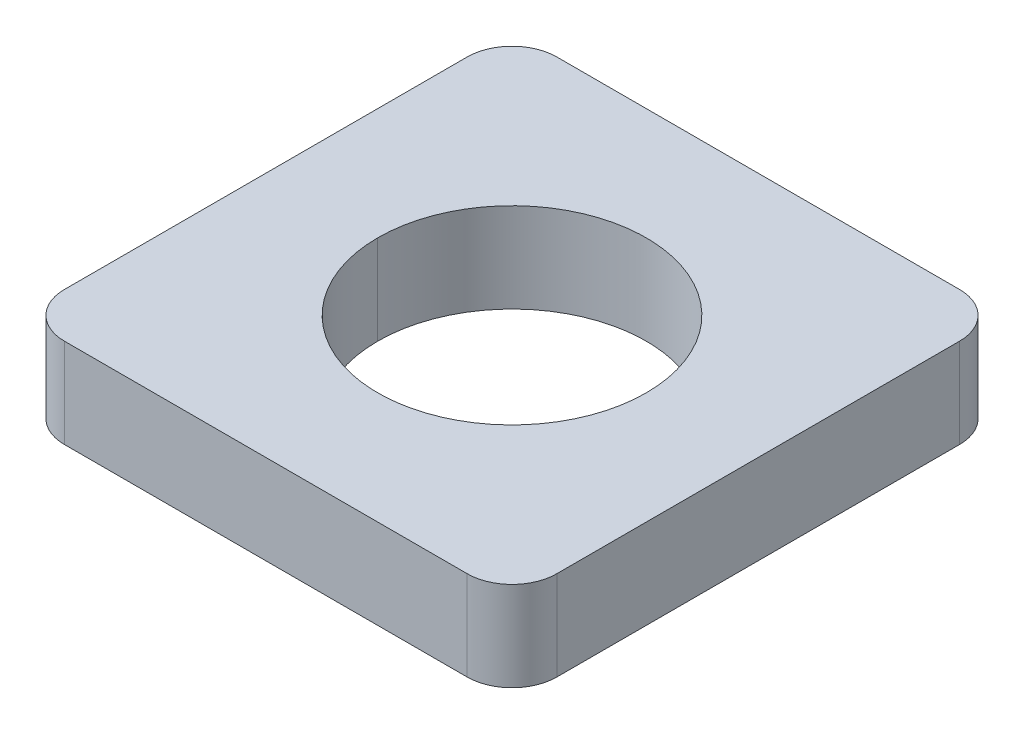
ISO-10303-21;
HEADER;
FILE_DESCRIPTION(('STEP AP214'),'2;1');
FILE_NAME('part.step','',(''),(''),'','','');
FILE_SCHEMA(('AUTOMOTIVE_DESIGN { 1 0 10303 214 1 1 1 1 }'));
ENDSEC;
DATA;
#1=APPLICATION_CONTEXT('core data for automotive mechanical design processes');
#2=APPLICATION_PROTOCOL_DEFINITION('international standard','automotive_design',2000,#1);
#3=PRODUCT_CONTEXT('',#1,'mechanical');
#4=PRODUCT('Part','Part','',(#3));
#5=PRODUCT_RELATED_PRODUCT_CATEGORY('part','',(#4));
#6=PRODUCT_DEFINITION_FORMATION('','',#4);
#7=PRODUCT_DEFINITION_CONTEXT('part definition',#1,'design');
#8=PRODUCT_DEFINITION('design','',#6,#7);
#9=PRODUCT_DEFINITION_SHAPE('','',#8);
#10=(LENGTH_UNIT() NAMED_UNIT(*) SI_UNIT(.MILLI.,.METRE.));
#11=(NAMED_UNIT(*) PLANE_ANGLE_UNIT() SI_UNIT($,.RADIAN.));
#12=(NAMED_UNIT(*) SI_UNIT($,.STERADIAN.) SOLID_ANGLE_UNIT());
#13=UNCERTAINTY_MEASURE_WITH_UNIT(LENGTH_MEASURE(1.E-05),#10,'distance_accuracy_value','');
#14=(GEOMETRIC_REPRESENTATION_CONTEXT(3) GLOBAL_UNCERTAINTY_ASSIGNED_CONTEXT((#13)) GLOBAL_UNIT_ASSIGNED_CONTEXT((#10,
#11,#12)) REPRESENTATION_CONTEXT('',''));
#15=CARTESIAN_POINT('',(0.,0.,0.));
#16=DIRECTION('',(0.,0.,1.));
#17=DIRECTION('',(1.,0.,0.));
#18=AXIS2_PLACEMENT_3D('',#15,#16,#17);
#19=CARTESIAN_POINT('',(2.75,0.,-2.75));
#20=DIRECTION('',(0.,0.,-1.));
#21=DIRECTION('',(0.,-1.,0.));
#22=AXIS2_PLACEMENT_3D('',#19,#20,#21);
#23=PLANE('',#22);
#24=DIRECTION('',(-1.,0.,0.));
#25=VECTOR('',#24,1.);
#26=CARTESIAN_POINT('',(2.25,0.,-2.75));
#27=LINE('',#26,#25);
#28=CARTESIAN_POINT('',(2.25,0.,-2.75));
#29=VERTEX_POINT('',#28);
#30=CARTESIAN_POINT('',(-2.25,0.,-2.75));
#31=VERTEX_POINT('',#30);
#32=EDGE_CURVE('E199',#29,#31,#27,.T.);
#33=ORIENTED_EDGE('',*,*,#32,.T.);
#34=DIRECTION('',(0.,-1.,0.));
#35=VECTOR('',#34,1.);
#36=CARTESIAN_POINT('',(-2.25,1.,-2.75));
#37=LINE('',#36,#35);
#38=CARTESIAN_POINT('',(-2.25,1.,-2.75));
#39=VERTEX_POINT('',#38);
#40=EDGE_CURVE('E11',#39,#31,#37,.T.);
#41=ORIENTED_EDGE('',*,*,#40,.F.);
#42=DIRECTION('',(-1.,0.,0.));
#43=VECTOR('',#42,1.);
#44=CARTESIAN_POINT('',(2.25,1.,-2.75));
#45=LINE('',#44,#43);
#46=CARTESIAN_POINT('',(2.25,1.,-2.75));
#47=VERTEX_POINT('',#46);
#48=EDGE_CURVE('E149',#47,#39,#45,.T.);
#49=ORIENTED_EDGE('',*,*,#48,.F.);
#50=DIRECTION('',(0.,-1.,0.));
#51=VECTOR('',#50,1.);
#52=CARTESIAN_POINT('',(2.25,1.,-2.75));
#53=LINE('',#52,#51);
#54=EDGE_CURVE('E74',#47,#29,#53,.T.);
#55=ORIENTED_EDGE('',*,*,#54,.T.);
#56=EDGE_LOOP('',(#33,#41,#49,#55));
#57=FACE_BOUND('',#56,.T.);
#58=ADVANCED_FACE('F17',(#57),#23,.T.);
#59=CARTESIAN_POINT('',(-2.25,2.3036,-2.25));
#60=DIRECTION('',(0.,-1.,0.));
#61=DIRECTION('',(-1.,0.,0.));
#62=AXIS2_PLACEMENT_3D('',#59,#60,#61);
#63=CYLINDRICAL_SURFACE('',#62,0.5);
#64=DIRECTION('',(0.,-1.,0.));
#65=VECTOR('',#64,1.);
#66=CARTESIAN_POINT('',(-2.75,1.,-2.25));
#67=LINE('',#66,#65);
#68=CARTESIAN_POINT('',(-2.75,1.,-2.25));
#69=VERTEX_POINT('',#68);
#70=CARTESIAN_POINT('',(-2.75,0.,-2.25));
#71=VERTEX_POINT('',#70);
#72=EDGE_CURVE('E28',#69,#71,#67,.T.);
#73=ORIENTED_EDGE('',*,*,#72,.F.);
#74=CARTESIAN_POINT('',(-2.25,1.,-2.25));
#75=DIRECTION('',(0.,1.,0.));
#76=DIRECTION('',(0.,0.,-1.));
#77=AXIS2_PLACEMENT_3D('',#74,#75,#76);
#78=CIRCLE('',#77,0.5);
#79=EDGE_CURVE('E231',#39,#69,#78,.T.);
#80=ORIENTED_EDGE('',*,*,#79,.F.);
#81=ORIENTED_EDGE('',*,*,#40,.T.);
#82=CARTESIAN_POINT('',(-2.25,0.,-2.25));
#83=DIRECTION('',(0.,-1.,0.));
#84=DIRECTION('',(-1.,0.,0.));
#85=AXIS2_PLACEMENT_3D('',#82,#83,#84);
#86=CIRCLE('',#85,0.5);
#87=EDGE_CURVE('E176',#71,#31,#86,.T.);
#88=ORIENTED_EDGE('',*,*,#87,.F.);
#89=EDGE_LOOP('',(#73,#80,#81,#88));
#90=FACE_BOUND('',#89,.T.);
#91=ADVANCED_FACE('F481',(#90),#63,.T.);
#92=CARTESIAN_POINT('',(-2.75,0.,-2.75));
#93=DIRECTION('',(-1.,0.,0.));
#94=DIRECTION('',(0.,0.,1.));
#95=AXIS2_PLACEMENT_3D('',#92,#93,#94);
#96=PLANE('',#95);
#97=DIRECTION('',(0.,0.,1.));
#98=VECTOR('',#97,1.);
#99=CARTESIAN_POINT('',(-2.75,1.,-2.25));
#100=LINE('',#99,#98);
#101=CARTESIAN_POINT('',(-2.75,1.,2.25));
#102=VERTEX_POINT('',#101);
#103=EDGE_CURVE('E210',#69,#102,#100,.T.);
#104=ORIENTED_EDGE('',*,*,#103,.F.);
#105=ORIENTED_EDGE('',*,*,#72,.T.);
#106=DIRECTION('',(0.,0.,1.));
#107=VECTOR('',#106,1.);
#108=CARTESIAN_POINT('',(-2.75,0.,-2.25));
#109=LINE('',#108,#107);
#110=CARTESIAN_POINT('',(-2.75,0.,2.25));
#111=VERTEX_POINT('',#110);
#112=EDGE_CURVE('E174',#71,#111,#109,.T.);
#113=ORIENTED_EDGE('',*,*,#112,.T.);
#114=DIRECTION('',(0.,-1.,0.));
#115=VECTOR('',#114,1.);
#116=CARTESIAN_POINT('',(-2.75,1.,2.25));
#117=LINE('',#116,#115);
#118=EDGE_CURVE('E127',#102,#111,#117,.T.);
#119=ORIENTED_EDGE('',*,*,#118,.F.);
#120=EDGE_LOOP('',(#104,#105,#113,#119));
#121=FACE_BOUND('',#120,.T.);
#122=ADVANCED_FACE('F19',(#121),#96,.T.);
#123=CARTESIAN_POINT('',(-2.25,2.3036,2.25));
#124=DIRECTION('',(0.,-1.,0.));
#125=DIRECTION('',(0.,0.,1.));
#126=AXIS2_PLACEMENT_3D('',#123,#124,#125);
#127=CYLINDRICAL_SURFACE('',#126,0.5);
#128=DIRECTION('',(0.,-1.,0.));
#129=VECTOR('',#128,1.);
#130=CARTESIAN_POINT('',(-2.25,1.,2.75));
#131=LINE('',#130,#129);
#132=CARTESIAN_POINT('',(-2.25,1.,2.75));
#133=VERTEX_POINT('',#132);
#134=CARTESIAN_POINT('',(-2.25,0.,2.75));
#135=VERTEX_POINT('',#134);
#136=EDGE_CURVE('E116',#133,#135,#131,.T.);
#137=ORIENTED_EDGE('',*,*,#136,.F.);
#138=CARTESIAN_POINT('',(-2.25,1.,2.25));
#139=DIRECTION('',(0.,1.,0.));
#140=DIRECTION('',(-1.,0.,0.));
#141=AXIS2_PLACEMENT_3D('',#138,#139,#140);
#142=CIRCLE('',#141,0.5);
#143=EDGE_CURVE('E187',#102,#133,#142,.T.);
#144=ORIENTED_EDGE('',*,*,#143,.F.);
#145=ORIENTED_EDGE('',*,*,#118,.T.);
#146=CARTESIAN_POINT('',(-2.25,0.,2.25));
#147=DIRECTION('',(0.,-1.,0.));
#148=DIRECTION('',(0.,0.,1.));
#149=AXIS2_PLACEMENT_3D('',#146,#147,#148);
#150=CIRCLE('',#149,0.5);
#151=EDGE_CURVE('E177',#135,#111,#150,.T.);
#152=ORIENTED_EDGE('',*,*,#151,.F.);
#153=EDGE_LOOP('',(#137,#144,#145,#152));
#154=FACE_BOUND('',#153,.T.);
#155=ADVANCED_FACE('F502',(#154),#127,.T.);
#156=CARTESIAN_POINT('',(-2.75,0.,2.75));
#157=DIRECTION('',(0.,0.,1.));
#158=DIRECTION('',(1.,0.,0.));
#159=AXIS2_PLACEMENT_3D('',#156,#157,#158);
#160=PLANE('',#159);
#161=DIRECTION('',(1.,0.,0.));
#162=VECTOR('',#161,1.);
#163=CARTESIAN_POINT('',(-2.25,1.,2.75));
#164=LINE('',#163,#162);
#165=CARTESIAN_POINT('',(2.25,1.,2.75));
#166=VERTEX_POINT('',#165);
#167=EDGE_CURVE('E183',#133,#166,#164,.T.);
#168=ORIENTED_EDGE('',*,*,#167,.F.);
#169=ORIENTED_EDGE('',*,*,#136,.T.);
#170=DIRECTION('',(1.,0.,0.));
#171=VECTOR('',#170,1.);
#172=CARTESIAN_POINT('',(-2.25,0.,2.75));
#173=LINE('',#172,#171);
#174=CARTESIAN_POINT('',(2.25,0.,2.75));
#175=VERTEX_POINT('',#174);
#176=EDGE_CURVE('E188',#135,#175,#173,.T.);
#177=ORIENTED_EDGE('',*,*,#176,.T.);
#178=DIRECTION('',(0.,-1.,0.));
#179=VECTOR('',#178,1.);
#180=CARTESIAN_POINT('',(2.25,1.,2.75));
#181=LINE('',#180,#179);
#182=EDGE_CURVE('E201',#166,#175,#181,.T.);
#183=ORIENTED_EDGE('',*,*,#182,.F.);
#184=EDGE_LOOP('',(#168,#169,#177,#183));
#185=FACE_BOUND('',#184,.T.);
#186=ADVANCED_FACE('F247',(#185),#160,.T.);
#187=CARTESIAN_POINT('',(2.25,2.3036,2.25));
#188=DIRECTION('',(0.,-1.,0.));
#189=DIRECTION('',(1.,0.,0.));
#190=AXIS2_PLACEMENT_3D('',#187,#188,#189);
#191=CYLINDRICAL_SURFACE('',#190,0.5);
#192=DIRECTION('',(0.,-1.,0.));
#193=VECTOR('',#192,1.);
#194=CARTESIAN_POINT('',(2.75,1.,2.25));
#195=LINE('',#194,#193);
#196=CARTESIAN_POINT('',(2.75,1.,2.25));
#197=VERTEX_POINT('',#196);
#198=CARTESIAN_POINT('',(2.75,0.,2.25));
#199=VERTEX_POINT('',#198);
#200=EDGE_CURVE('E195',#197,#199,#195,.T.);
#201=ORIENTED_EDGE('',*,*,#200,.F.);
#202=CARTESIAN_POINT('',(2.25,1.,2.25));
#203=DIRECTION('',(0.,1.,0.));
#204=DIRECTION('',(0.,0.,1.));
#205=AXIS2_PLACEMENT_3D('',#202,#203,#204);
#206=CIRCLE('',#205,0.5);
#207=EDGE_CURVE('E21',#166,#197,#206,.T.);
#208=ORIENTED_EDGE('',*,*,#207,.F.);
#209=ORIENTED_EDGE('',*,*,#182,.T.);
#210=CARTESIAN_POINT('',(2.25,0.,2.25));
#211=DIRECTION('',(0.,-1.,0.));
#212=DIRECTION('',(1.,0.,0.));
#213=AXIS2_PLACEMENT_3D('',#210,#211,#212);
#214=CIRCLE('',#213,0.5);
#215=EDGE_CURVE('E191',#199,#175,#214,.T.);
#216=ORIENTED_EDGE('',*,*,#215,.F.);
#217=EDGE_LOOP('',(#201,#208,#209,#216));
#218=FACE_BOUND('',#217,.T.);
#219=ADVANCED_FACE('F242',(#218),#191,.T.);
#220=CARTESIAN_POINT('',(2.75,0.,2.75));
#221=DIRECTION('',(1.,0.,0.));
#222=DIRECTION('',(0.,1.,0.));
#223=AXIS2_PLACEMENT_3D('',#220,#221,#222);
#224=PLANE('',#223);
#225=DIRECTION('',(0.,0.,-1.));
#226=VECTOR('',#225,1.);
#227=CARTESIAN_POINT('',(2.75,1.,2.25));
#228=LINE('',#227,#226);
#229=CARTESIAN_POINT('',(2.75,1.,-2.25));
#230=VERTEX_POINT('',#229);
#231=EDGE_CURVE('E182',#197,#230,#228,.T.);
#232=ORIENTED_EDGE('',*,*,#231,.F.);
#233=ORIENTED_EDGE('',*,*,#200,.T.);
#234=DIRECTION('',(0.,0.,-1.));
#235=VECTOR('',#234,1.);
#236=CARTESIAN_POINT('',(2.75,0.,2.25));
#237=LINE('',#236,#235);
#238=CARTESIAN_POINT('',(2.75,0.,-2.25));
#239=VERTEX_POINT('',#238);
#240=EDGE_CURVE('E219',#199,#239,#237,.T.);
#241=ORIENTED_EDGE('',*,*,#240,.T.);
#242=DIRECTION('',(0.,-1.,0.));
#243=VECTOR('',#242,1.);
#244=CARTESIAN_POINT('',(2.75,1.,-2.25));
#245=LINE('',#244,#243);
#246=EDGE_CURVE('E42',#230,#239,#245,.T.);
#247=ORIENTED_EDGE('',*,*,#246,.F.);
#248=EDGE_LOOP('',(#232,#233,#241,#247));
#249=FACE_BOUND('',#248,.T.);
#250=ADVANCED_FACE('F252',(#249),#224,.T.);
#251=CARTESIAN_POINT('',(2.25,2.3036,-2.25));
#252=DIRECTION('',(0.,-1.,0.));
#253=DIRECTION('',(0.,0.,-1.));
#254=AXIS2_PLACEMENT_3D('',#251,#252,#253);
#255=CYLINDRICAL_SURFACE('',#254,0.5);
#256=ORIENTED_EDGE('',*,*,#54,.F.);
#257=CARTESIAN_POINT('',(2.25,1.,-2.25));
#258=DIRECTION('',(0.,1.,0.));
#259=DIRECTION('',(1.,0.,0.));
#260=AXIS2_PLACEMENT_3D('',#257,#258,#259);
#261=CIRCLE('',#260,0.5);
#262=EDGE_CURVE('E178',#230,#47,#261,.T.);
#263=ORIENTED_EDGE('',*,*,#262,.F.);
#264=ORIENTED_EDGE('',*,*,#246,.T.);
#265=CARTESIAN_POINT('',(2.25,0.,-2.25));
#266=DIRECTION('',(0.,-1.,0.));
#267=DIRECTION('',(0.,0.,-1.));
#268=AXIS2_PLACEMENT_3D('',#265,#266,#267);
#269=CIRCLE('',#268,0.5);
#270=EDGE_CURVE('E213',#29,#239,#269,.T.);
#271=ORIENTED_EDGE('',*,*,#270,.F.);
#272=EDGE_LOOP('',(#256,#263,#264,#271));
#273=FACE_BOUND('',#272,.T.);
#274=ADVANCED_FACE('F533',(#273),#255,.T.);
#275=CARTESIAN_POINT('',(0.,1.,0.));
#276=DIRECTION('',(0.,1.,0.));
#277=DIRECTION('',(1.,0.,0.));
#278=AXIS2_PLACEMENT_3D('',#275,#276,#277);
#279=PLANE('',#278);
#280=CARTESIAN_POINT('',(0.,1.,0.));
#281=DIRECTION('',(0.,-1.,0.));
#282=DIRECTION('',(-1.,0.,0.));
#283=AXIS2_PLACEMENT_3D('',#280,#281,#282);
#284=CIRCLE('',#283,1.5);
#285=CARTESIAN_POINT('',(-1.5,1.,0.));
#286=VERTEX_POINT('',#285);
#287=CARTESIAN_POINT('',(1.5,1.,0.));
#288=VERTEX_POINT('',#287);
#289=EDGE_CURVE('E136',#286,#288,#284,.T.);
#290=ORIENTED_EDGE('',*,*,#289,.T.);
#291=CARTESIAN_POINT('',(0.,1.,0.));
#292=DIRECTION('',(0.,-1.,0.));
#293=DIRECTION('',(1.,0.,0.));
#294=AXIS2_PLACEMENT_3D('',#291,#292,#293);
#295=CIRCLE('',#294,1.5);
#296=EDGE_CURVE('E151',#288,#286,#295,.T.);
#297=ORIENTED_EDGE('',*,*,#296,.T.);
#298=EDGE_LOOP('',(#290,#297));
#299=FACE_BOUND('',#298,.T.);
#300=ORIENTED_EDGE('',*,*,#48,.T.);
#301=ORIENTED_EDGE('',*,*,#79,.T.);
#302=ORIENTED_EDGE('',*,*,#103,.T.);
#303=ORIENTED_EDGE('',*,*,#143,.T.);
#304=ORIENTED_EDGE('',*,*,#167,.T.);
#305=ORIENTED_EDGE('',*,*,#207,.T.);
#306=ORIENTED_EDGE('',*,*,#231,.T.);
#307=ORIENTED_EDGE('',*,*,#262,.T.);
#308=EDGE_LOOP('',(#300,#301,#302,#303,#304,#305,#306,#307));
#309=FACE_BOUND('',#308,.T.);
#310=ADVANCED_FACE('F152',(#299,#309),#279,.T.);
#311=CARTESIAN_POINT('',(0.,0.,0.));
#312=DIRECTION('',(0.,1.,0.));
#313=DIRECTION('',(1.,0.,0.));
#314=AXIS2_PLACEMENT_3D('',#311,#312,#313);
#315=CYLINDRICAL_SURFACE('',#314,1.5);
#316=DIRECTION('',(0.,1.,0.));
#317=VECTOR('',#316,1.);
#318=CARTESIAN_POINT('',(1.5,0.,0.));
#319=LINE('',#318,#317);
#320=CARTESIAN_POINT('',(1.5,0.,0.));
#321=VERTEX_POINT('',#320);
#322=EDGE_CURVE('E146',#321,#288,#319,.T.);
#323=ORIENTED_EDGE('',*,*,#322,.T.);
#324=ORIENTED_EDGE('',*,*,#289,.F.);
#325=DIRECTION('',(0.,1.,0.));
#326=VECTOR('',#325,1.);
#327=CARTESIAN_POINT('',(-1.5,0.,0.));
#328=LINE('',#327,#326);
#329=CARTESIAN_POINT('',(-1.5,0.,0.));
#330=VERTEX_POINT('',#329);
#331=EDGE_CURVE('E144',#330,#286,#328,.T.);
#332=ORIENTED_EDGE('',*,*,#331,.F.);
#333=CARTESIAN_POINT('',(0.,0.,0.));
#334=DIRECTION('',(0.,-1.,0.));
#335=DIRECTION('',(-1.,0.,0.));
#336=AXIS2_PLACEMENT_3D('',#333,#334,#335);
#337=CIRCLE('',#336,1.5);
#338=EDGE_CURVE('E169',#330,#321,#337,.T.);
#339=ORIENTED_EDGE('',*,*,#338,.T.);
#340=EDGE_LOOP('',(#323,#324,#332,#339));
#341=FACE_BOUND('',#340,.T.);
#342=ADVANCED_FACE('F141',(#341),#315,.F.);
#343=CARTESIAN_POINT('',(0.,0.,0.));
#344=DIRECTION('',(0.,1.,0.));
#345=DIRECTION('',(1.,0.,0.));
#346=AXIS2_PLACEMENT_3D('',#343,#344,#345);
#347=CYLINDRICAL_SURFACE('',#346,1.5);
#348=ORIENTED_EDGE('',*,*,#331,.T.);
#349=ORIENTED_EDGE('',*,*,#296,.F.);
#350=ORIENTED_EDGE('',*,*,#322,.F.);
#351=CARTESIAN_POINT('',(0.,0.,0.));
#352=DIRECTION('',(0.,-1.,0.));
#353=DIRECTION('',(1.,0.,0.));
#354=AXIS2_PLACEMENT_3D('',#351,#352,#353);
#355=CIRCLE('',#354,1.5);
#356=EDGE_CURVE('E159',#321,#330,#355,.T.);
#357=ORIENTED_EDGE('',*,*,#356,.T.);
#358=EDGE_LOOP('',(#348,#349,#350,#357));
#359=FACE_BOUND('',#358,.T.);
#360=ADVANCED_FACE('F157',(#359),#347,.F.);
#361=CARTESIAN_POINT('',(0.,0.,0.));
#362=DIRECTION('',(0.,1.,0.));
#363=DIRECTION('',(1.,0.,0.));
#364=AXIS2_PLACEMENT_3D('',#361,#362,#363);
#365=PLANE('',#364);
#366=ORIENTED_EDGE('',*,*,#338,.F.);
#367=ORIENTED_EDGE('',*,*,#356,.F.);
#368=EDGE_LOOP('',(#366,#367));
#369=FACE_BOUND('',#368,.T.);
#370=ORIENTED_EDGE('',*,*,#240,.F.);
#371=ORIENTED_EDGE('',*,*,#215,.T.);
#372=ORIENTED_EDGE('',*,*,#176,.F.);
#373=ORIENTED_EDGE('',*,*,#151,.T.);
#374=ORIENTED_EDGE('',*,*,#112,.F.);
#375=ORIENTED_EDGE('',*,*,#87,.T.);
#376=ORIENTED_EDGE('',*,*,#32,.F.);
#377=ORIENTED_EDGE('',*,*,#270,.T.);
#378=EDGE_LOOP('',(#370,#371,#372,#373,#374,#375,#376,#377));
#379=FACE_BOUND('',#378,.T.);
#380=ADVANCED_FACE('F249',(#369,#379),#365,.F.);
#381=CLOSED_SHELL('',(#58,#91,#122,#155,#186,#219,#250,#274,#310,#342,#360,#380));
#382=MANIFOLD_SOLID_BREP('B1',#381);
#383=ADVANCED_BREP_SHAPE_REPRESENTATION('',(#18,#382),#14);
#384=SHAPE_DEFINITION_REPRESENTATION(#9,#383);
ENDSEC;
END-ISO-10303-21;
